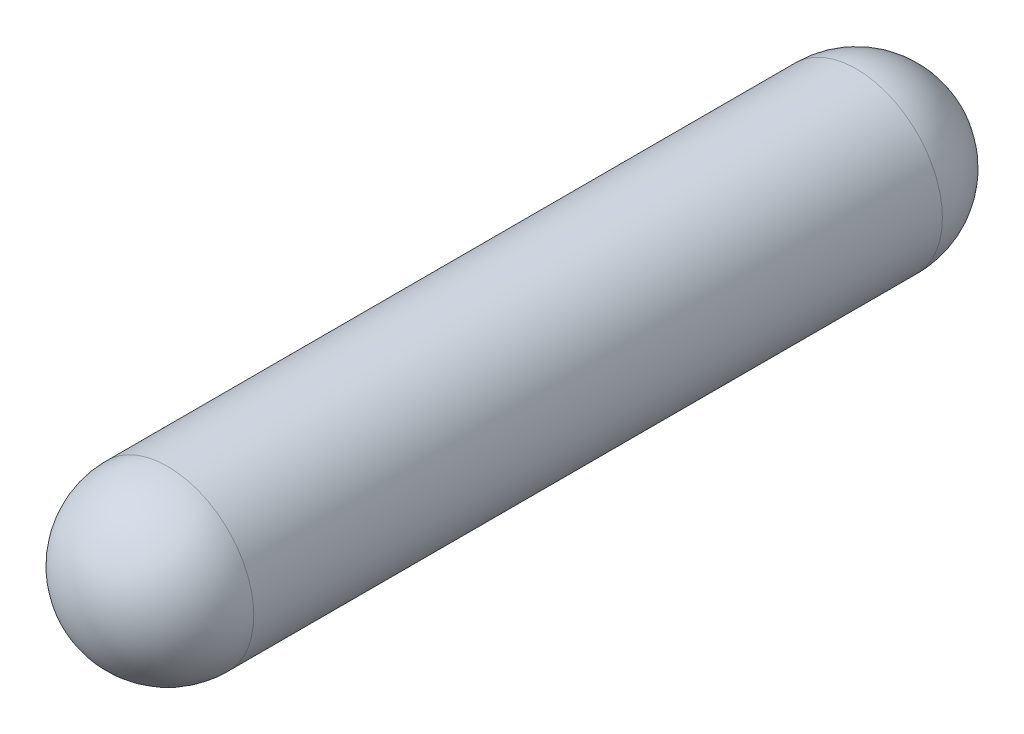
ISO-10303-21;
HEADER;
FILE_DESCRIPTION(('STEP AP214'),'2;1');
FILE_NAME('part.step','',(''),(''),'','','');
FILE_SCHEMA(('AUTOMOTIVE_DESIGN { 1 0 10303 214 1 1 1 1 }'));
ENDSEC;
DATA;
#1=APPLICATION_CONTEXT('core data for automotive mechanical design processes');
#2=APPLICATION_PROTOCOL_DEFINITION('international standard','automotive_design',2000,#1);
#3=PRODUCT_CONTEXT('',#1,'mechanical');
#4=PRODUCT('Part','Part','',(#3));
#5=PRODUCT_RELATED_PRODUCT_CATEGORY('part','',(#4));
#6=PRODUCT_DEFINITION_FORMATION('','',#4);
#7=PRODUCT_DEFINITION_CONTEXT('part definition',#1,'design');
#8=PRODUCT_DEFINITION('design','',#6,#7);
#9=PRODUCT_DEFINITION_SHAPE('','',#8);
#10=(LENGTH_UNIT() NAMED_UNIT(*) SI_UNIT(.MILLI.,.METRE.));
#11=(NAMED_UNIT(*) PLANE_ANGLE_UNIT() SI_UNIT($,.RADIAN.));
#12=(NAMED_UNIT(*) SI_UNIT($,.STERADIAN.) SOLID_ANGLE_UNIT());
#13=UNCERTAINTY_MEASURE_WITH_UNIT(LENGTH_MEASURE(1.E-05),#10,'distance_accuracy_value','');
#14=(GEOMETRIC_REPRESENTATION_CONTEXT(3) GLOBAL_UNCERTAINTY_ASSIGNED_CONTEXT((#13)) GLOBAL_UNIT_ASSIGNED_CONTEXT((#10,
#11,#12)) REPRESENTATION_CONTEXT('',''));
#15=CARTESIAN_POINT('',(0.,0.,0.));
#16=DIRECTION('',(0.,0.,1.));
#17=DIRECTION('',(1.,0.,0.));
#18=AXIS2_PLACEMENT_3D('',#15,#16,#17);
#19=CARTESIAN_POINT('',(0.,0.,-1000.));
#20=DIRECTION('',(0.,0.,1.));
#21=DIRECTION('',(-1.,0.,0.));
#22=AXIS2_PLACEMENT_3D('',#19,#20,#21);
#23=SPHERICAL_SURFACE('',#22,1000.);
#24=CARTESIAN_POINT('',(0.,0.,-1000.));
#25=DIRECTION('',(0.,0.,1.));
#26=DIRECTION('',(1.,0.,0.));
#27=AXIS2_PLACEMENT_3D('',#24,#25,#26);
#28=CIRCLE('',#27,1000.);
#29=CARTESIAN_POINT('',(1000.,0.,-1000.));
#30=VERTEX_POINT('',#29);
#31=EDGE_CURVE('E10',#30,#30,#28,.T.);
#32=ORIENTED_EDGE('',*,*,#31,.T.);
#33=EDGE_LOOP('',(#32));
#34=FACE_BOUND('',#33,.T.);
#35=ADVANCED_FACE('F29',(#34),#23,.T.);
#36=CARTESIAN_POINT('',(0.,0.,0.));
#37=DIRECTION('',(0.,0.,1.));
#38=DIRECTION('',(1.,0.,0.));
#39=AXIS2_PLACEMENT_3D('',#36,#37,#38);
#40=CYLINDRICAL_SURFACE('',#39,1000.);
#41=CARTESIAN_POINT('',(0.,0.,-9000.));
#42=DIRECTION('',(0.,0.,1.));
#43=DIRECTION('',(1.,0.,0.));
#44=AXIS2_PLACEMENT_3D('',#41,#42,#43);
#45=CIRCLE('',#44,1000.);
#46=CARTESIAN_POINT('',(1000.,0.,-9000.));
#47=VERTEX_POINT('',#46);
#48=EDGE_CURVE('E35',#47,#47,#45,.T.);
#49=ORIENTED_EDGE('',*,*,#48,.T.);
#50=EDGE_LOOP('',(#49));
#51=FACE_BOUND('',#50,.T.);
#52=ORIENTED_EDGE('',*,*,#31,.F.);
#53=EDGE_LOOP('',(#52));
#54=FACE_BOUND('',#53,.T.);
#55=ADVANCED_FACE('F41',(#51,#54),#40,.T.);
#56=CARTESIAN_POINT('',(0.,0.,-9000.));
#57=DIRECTION('',(0.,0.,1.));
#58=DIRECTION('',(1.,0.,0.));
#59=AXIS2_PLACEMENT_3D('',#56,#57,#58);
#60=SPHERICAL_SURFACE('',#59,1000.);
#61=ORIENTED_EDGE('',*,*,#48,.F.);
#62=EDGE_LOOP('',(#61));
#63=FACE_BOUND('',#62,.T.);
#64=ADVANCED_FACE('F44',(#63),#60,.T.);
#65=CLOSED_SHELL('',(#35,#55,#64));
#66=MANIFOLD_SOLID_BREP('B2',#65);
#67=ADVANCED_BREP_SHAPE_REPRESENTATION('',(#18,#66),#14);
#68=SHAPE_DEFINITION_REPRESENTATION(#9,#67);
ENDSEC;
END-ISO-10303-21;
